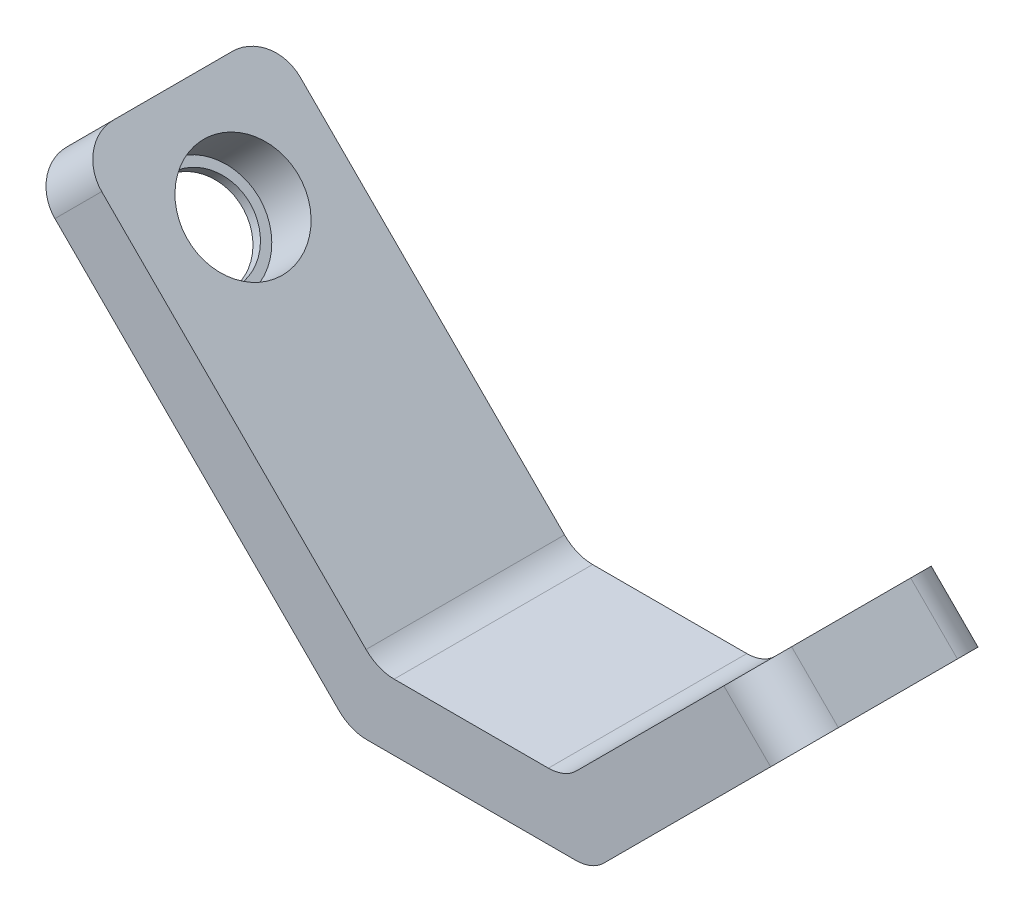
ISO-10303-21;
HEADER;
FILE_DESCRIPTION(('STEP AP214'),'2;1');
FILE_NAME('part.step','',(''),(''),'','','');
FILE_SCHEMA(('AUTOMOTIVE_DESIGN { 1 0 10303 214 1 1 1 1 }'));
ENDSEC;
DATA;
#1=APPLICATION_CONTEXT('core data for automotive mechanical design processes');
#2=APPLICATION_PROTOCOL_DEFINITION('international standard','automotive_design',2000,#1);
#3=PRODUCT_CONTEXT('',#1,'mechanical');
#4=PRODUCT('Part','Part','',(#3));
#5=PRODUCT_RELATED_PRODUCT_CATEGORY('part','',(#4));
#6=PRODUCT_DEFINITION_FORMATION('','',#4);
#7=PRODUCT_DEFINITION_CONTEXT('part definition',#1,'design');
#8=PRODUCT_DEFINITION('design','',#6,#7);
#9=PRODUCT_DEFINITION_SHAPE('','',#8);
#10=(LENGTH_UNIT() NAMED_UNIT(*) SI_UNIT(.MILLI.,.METRE.));
#11=(NAMED_UNIT(*) PLANE_ANGLE_UNIT() SI_UNIT($,.RADIAN.));
#12=(NAMED_UNIT(*) SI_UNIT($,.STERADIAN.) SOLID_ANGLE_UNIT());
#13=UNCERTAINTY_MEASURE_WITH_UNIT(LENGTH_MEASURE(1.E-05),#10,'distance_accuracy_value','');
#14=(GEOMETRIC_REPRESENTATION_CONTEXT(3) GLOBAL_UNCERTAINTY_ASSIGNED_CONTEXT((#13)) GLOBAL_UNIT_ASSIGNED_CONTEXT((#10,
#11,#12)) REPRESENTATION_CONTEXT('',''));
#15=CARTESIAN_POINT('',(0.,0.,0.));
#16=DIRECTION('',(0.,0.,1.));
#17=DIRECTION('',(1.,0.,0.));
#18=AXIS2_PLACEMENT_3D('',#15,#16,#17);
#19=CARTESIAN_POINT('',(18.2842712474618,0.,7.5));
#20=DIRECTION('',(0.,1.,0.));
#21=DIRECTION('',(-1.,0.,0.));
#22=AXIS2_PLACEMENT_3D('',#19,#20,#21);
#23=PLANE('',#22);
#24=DIRECTION('',(1.,0.,0.));
#25=VECTOR('',#24,1.);
#26=CARTESIAN_POINT('',(18.2842712474618,0.,-7.5));
#27=LINE('',#26,#25);
#28=CARTESIAN_POINT('',(1.24264068711928,0.,-7.5));
#29=VERTEX_POINT('',#28);
#30=CARTESIAN_POINT('',(17.0416305603425,0.,-7.5));
#31=VERTEX_POINT('',#30);
#32=EDGE_CURVE('E285',#29,#31,#27,.T.);
#33=ORIENTED_EDGE('',*,*,#32,.T.);
#34=DIRECTION('',(0.,0.,-1.));
#35=VECTOR('',#34,1.);
#36=CARTESIAN_POINT('',(17.0416305603425,0.,7.5));
#37=LINE('',#36,#35);
#38=CARTESIAN_POINT('',(17.0416305603425,0.,7.5));
#39=VERTEX_POINT('',#38);
#40=EDGE_CURVE('E166',#31,#39,#37,.F.);
#41=ORIENTED_EDGE('',*,*,#40,.T.);
#42=DIRECTION('',(1.,0.,0.));
#43=VECTOR('',#42,1.);
#44=CARTESIAN_POINT('',(18.2842712474618,0.,7.5));
#45=LINE('',#44,#43);
#46=CARTESIAN_POINT('',(1.24264068711928,0.,7.5));
#47=VERTEX_POINT('',#46);
#48=EDGE_CURVE('E193',#47,#39,#45,.T.);
#49=ORIENTED_EDGE('',*,*,#48,.F.);
#50=DIRECTION('',(0.,0.,-1.));
#51=VECTOR('',#50,1.);
#52=CARTESIAN_POINT('',(1.24264068711928,0.,7.5));
#53=LINE('',#52,#51);
#54=EDGE_CURVE('E261',#47,#29,#53,.T.);
#55=ORIENTED_EDGE('',*,*,#54,.T.);
#56=EDGE_LOOP('',(#33,#41,#49,#55));
#57=FACE_BOUND('',#56,.T.);
#58=ADVANCED_FACE('F41',(#57),#23,.F.);
#59=CARTESIAN_POINT('',(33.8908729652601,15.6066017177983,7.5));
#60=DIRECTION('',(-0.707106781186549,0.707106781186547,0.));
#61=DIRECTION('',(-0.707106781186547,-0.707106781186549,0.));
#62=AXIS2_PLACEMENT_3D('',#59,#60,#61);
#63=PLANE('',#62);
#64=DIRECTION('',(0.707106781186547,0.707106781186549,0.));
#65=VECTOR('',#64,1.);
#66=CARTESIAN_POINT('',(33.8908729652601,15.6066017177983,-7.5));
#67=LINE('',#66,#65);
#68=CARTESIAN_POINT('',(19.1629509039022,0.878679656440356,-7.5));
#69=VERTEX_POINT('',#68);
#70=CARTESIAN_POINT('',(31.7695526217004,13.4852813742387,-7.5));
#71=VERTEX_POINT('',#70);
#72=EDGE_CURVE('E187',#69,#71,#67,.T.);
#73=ORIENTED_EDGE('',*,*,#72,.T.);
#74=CARTESIAN_POINT('',(31.7695526217004,13.4852813742386,-4.5));
#75=DIRECTION('',(-0.707106781186549,0.707106781186547,0.));
#76=DIRECTION('',(-0.707106781186547,-0.707106781186549,0.));
#77=AXIS2_PLACEMENT_3D('',#74,#75,#76);
#78=CIRCLE('',#77,3.);
#79=CARTESIAN_POINT('',(33.8908729652601,15.6066017177983,-4.5));
#80=VERTEX_POINT('',#79);
#81=EDGE_CURVE('E241',#71,#80,#78,.F.);
#82=ORIENTED_EDGE('',*,*,#81,.T.);
#83=DIRECTION('',(0.,0.,-1.));
#84=VECTOR('',#83,1.);
#85=CARTESIAN_POINT('',(33.8908729652601,15.6066017177983,7.5));
#86=LINE('',#85,#84);
#87=CARTESIAN_POINT('',(33.8908729652601,15.6066017177983,4.5));
#88=VERTEX_POINT('',#87);
#89=EDGE_CURVE('E203',#88,#80,#86,.T.);
#90=ORIENTED_EDGE('',*,*,#89,.F.);
#91=CARTESIAN_POINT('',(31.7695526217004,13.4852813742387,4.5));
#92=DIRECTION('',(-0.707106781186549,0.707106781186547,0.));
#93=DIRECTION('',(-0.707106781186547,-0.707106781186549,0.));
#94=AXIS2_PLACEMENT_3D('',#91,#92,#93);
#95=CIRCLE('',#94,3.);
#96=CARTESIAN_POINT('',(31.7695526217004,13.4852813742387,7.5));
#97=VERTEX_POINT('',#96);
#98=EDGE_CURVE('E239',#88,#97,#95,.F.);
#99=ORIENTED_EDGE('',*,*,#98,.T.);
#100=DIRECTION('',(0.707106781186547,0.707106781186549,0.));
#101=VECTOR('',#100,1.);
#102=CARTESIAN_POINT('',(33.8908729652601,15.6066017177983,7.5));
#103=LINE('',#102,#101);
#104=CARTESIAN_POINT('',(19.1629509039022,0.878679656440356,7.5));
#105=VERTEX_POINT('',#104);
#106=EDGE_CURVE('E274',#105,#97,#103,.T.);
#107=ORIENTED_EDGE('',*,*,#106,.F.);
#108=DIRECTION('',(0.,0.,-1.));
#109=VECTOR('',#108,1.);
#110=CARTESIAN_POINT('',(19.1629509039022,0.878679656440356,7.5));
#111=LINE('',#110,#109);
#112=EDGE_CURVE('E236',#105,#69,#111,.T.);
#113=ORIENTED_EDGE('',*,*,#112,.T.);
#114=EDGE_LOOP('',(#73,#82,#90,#99,#107,#113));
#115=FACE_BOUND('',#114,.T.);
#116=CARTESIAN_POINT('',(28.587572106361,10.3033008588992,0.));
#117=DIRECTION('',(-0.707106781186548,0.707106781186547,0.));
#118=DIRECTION('',(-0.707106781186547,-0.707106781186548,0.));
#119=AXIS2_PLACEMENT_3D('',#116,#117,#118);
#120=CIRCLE('',#119,3.5);
#121=CARTESIAN_POINT('',(26.1126983722081,7.82842712474625,0.));
#122=VERTEX_POINT('',#121);
#123=EDGE_CURVE('E616',#122,#122,#120,.T.);
#124=ORIENTED_EDGE('',*,*,#123,.T.);
#125=EDGE_LOOP('',(#124));
#126=FACE_BOUND('',#125,.T.);
#127=ADVANCED_FACE('F291',(#115,#126),#63,.F.);
#128=CARTESIAN_POINT('',(30.3553390593273,19.142135623731,7.5));
#129=DIRECTION('',(-0.707106781186546,-0.707106781186549,0.));
#130=DIRECTION('',(0.707106781186549,-0.707106781186546,0.));
#131=AXIS2_PLACEMENT_3D('',#128,#129,#130);
#132=PLANE('',#131);
#133=ORIENTED_EDGE('',*,*,#89,.T.);
#134=DIRECTION('',(-0.707106781186549,0.707106781186546,0.));
#135=VECTOR('',#134,1.);
#136=CARTESIAN_POINT('',(30.3553390593273,19.142135623731,-4.5));
#137=LINE('',#136,#135);
#138=CARTESIAN_POINT('',(30.3553390593273,19.142135623731,-4.5));
#139=VERTEX_POINT('',#138);
#140=EDGE_CURVE('E225',#80,#139,#137,.T.);
#141=ORIENTED_EDGE('',*,*,#140,.T.);
#142=DIRECTION('',(0.,0.,-1.));
#143=VECTOR('',#142,1.);
#144=CARTESIAN_POINT('',(30.3553390593273,19.142135623731,7.5));
#145=LINE('',#144,#143);
#146=CARTESIAN_POINT('',(30.3553390593273,19.142135623731,4.5));
#147=VERTEX_POINT('',#146);
#148=EDGE_CURVE('E200',#147,#139,#145,.T.);
#149=ORIENTED_EDGE('',*,*,#148,.F.);
#150=DIRECTION('',(-0.707106781186549,0.707106781186546,0.));
#151=VECTOR('',#150,1.);
#152=CARTESIAN_POINT('',(30.3553390593273,19.142135623731,4.5));
#153=LINE('',#152,#151);
#154=EDGE_CURVE('E223',#147,#88,#153,.F.);
#155=ORIENTED_EDGE('',*,*,#154,.T.);
#156=EDGE_LOOP('',(#133,#141,#149,#155));
#157=FACE_BOUND('',#156,.T.);
#158=ADVANCED_FACE('F302',(#157),#132,.F.);
#159=CARTESIAN_POINT('',(16.2132034355964,5.00000000000005,7.5));
#160=DIRECTION('',(0.707106781186549,-0.707106781186546,0.));
#161=DIRECTION('',(0.707106781186546,0.707106781186549,0.));
#162=AXIS2_PLACEMENT_3D('',#159,#160,#161);
#163=PLANE('',#162);
#164=CARTESIAN_POINT('',(25.0520382004282,13.8388347648319,0.));
#165=DIRECTION('',(0.707106781186549,-0.707106781186546,0.));
#166=DIRECTION('',(0.707106781186546,0.707106781186549,0.));
#167=AXIS2_PLACEMENT_3D('',#164,#165,#166);
#168=CIRCLE('',#167,4.2);
#169=CARTESIAN_POINT('',(28.0218866814117,16.8086832458154,0.));
#170=VERTEX_POINT('',#169);
#171=EDGE_CURVE('E206',#170,#170,#168,.T.);
#172=ORIENTED_EDGE('',*,*,#171,.T.);
#173=EDGE_LOOP('',(#172));
#174=FACE_BOUND('',#173,.T.);
#175=DIRECTION('',(-0.707106781186546,-0.707106781186549,0.));
#176=VECTOR('',#175,1.);
#177=CARTESIAN_POINT('',(16.2132034355964,5.00000000000005,-7.5));
#178=LINE('',#177,#176);
#179=CARTESIAN_POINT('',(28.2340187157677,17.0208152801714,-7.5));
#180=VERTEX_POINT('',#179);
#181=CARTESIAN_POINT('',(17.0918830920367,5.87867965644041,-7.5));
#182=VERTEX_POINT('',#181);
#183=EDGE_CURVE('E182',#180,#182,#178,.T.);
#184=ORIENTED_EDGE('',*,*,#183,.T.);
#185=DIRECTION('',(0.,0.,-1.));
#186=VECTOR('',#185,1.);
#187=CARTESIAN_POINT('',(17.0918830920367,5.87867965644041,7.5));
#188=LINE('',#187,#186);
#189=CARTESIAN_POINT('',(17.0918830920367,5.87867965644041,7.5));
#190=VERTEX_POINT('',#189);
#191=EDGE_CURVE('E160',#182,#190,#188,.F.);
#192=ORIENTED_EDGE('',*,*,#191,.T.);
#193=DIRECTION('',(-0.707106781186546,-0.707106781186549,0.));
#194=VECTOR('',#193,1.);
#195=CARTESIAN_POINT('',(16.2132034355964,5.00000000000005,7.5));
#196=LINE('',#195,#194);
#197=CARTESIAN_POINT('',(28.2340187157677,17.0208152801714,7.5));
#198=VERTEX_POINT('',#197);
#199=EDGE_CURVE('E271',#198,#190,#196,.T.);
#200=ORIENTED_EDGE('',*,*,#199,.F.);
#201=CARTESIAN_POINT('',(28.2340187157677,17.0208152801714,4.5));
#202=DIRECTION('',(0.707106781186549,-0.707106781186546,0.));
#203=DIRECTION('',(0.707106781186546,0.707106781186549,0.));
#204=AXIS2_PLACEMENT_3D('',#201,#202,#203);
#205=CIRCLE('',#204,3.);
#206=EDGE_CURVE('E176',#198,#147,#205,.F.);
#207=ORIENTED_EDGE('',*,*,#206,.T.);
#208=ORIENTED_EDGE('',*,*,#148,.T.);
#209=CARTESIAN_POINT('',(28.2340187157677,17.0208152801714,-4.5));
#210=DIRECTION('',(0.707106781186549,-0.707106781186546,0.));
#211=DIRECTION('',(0.707106781186546,0.707106781186549,0.));
#212=AXIS2_PLACEMENT_3D('',#209,#210,#211);
#213=CIRCLE('',#212,3.);
#214=EDGE_CURVE('E213',#139,#180,#213,.F.);
#215=ORIENTED_EDGE('',*,*,#214,.T.);
#216=EDGE_LOOP('',(#184,#192,#200,#207,#208,#215));
#217=FACE_BOUND('',#216,.T.);
#218=ADVANCED_FACE('F304',(#174,#217),#163,.F.);
#219=CARTESIAN_POINT('',(2.07106781186543,5.00000000000005,7.5));
#220=DIRECTION('',(0.,-1.,0.));
#221=DIRECTION('',(1.,0.,0.));
#222=AXIS2_PLACEMENT_3D('',#219,#220,#221);
#223=PLANE('',#222);
#224=DIRECTION('',(-1.,0.,0.));
#225=VECTOR('',#224,1.);
#226=CARTESIAN_POINT('',(2.07106781186543,5.00000000000005,7.5));
#227=LINE('',#226,#225);
#228=CARTESIAN_POINT('',(14.9705627484771,5.00000000000005,7.5));
#229=VERTEX_POINT('',#228);
#230=CARTESIAN_POINT('',(3.31370849898471,5.00000000000005,7.5));
#231=VERTEX_POINT('',#230);
#232=EDGE_CURVE('E175',#229,#231,#227,.T.);
#233=ORIENTED_EDGE('',*,*,#232,.F.);
#234=DIRECTION('',(0.,0.,-1.));
#235=VECTOR('',#234,1.);
#236=CARTESIAN_POINT('',(14.9705627484771,5.00000000000005,-7.5));
#237=LINE('',#236,#235);
#238=CARTESIAN_POINT('',(14.9705627484771,5.00000000000005,-7.5));
#239=VERTEX_POINT('',#238);
#240=EDGE_CURVE('E159',#229,#239,#237,.T.);
#241=ORIENTED_EDGE('',*,*,#240,.T.);
#242=DIRECTION('',(-1.,0.,0.));
#243=VECTOR('',#242,1.);
#244=CARTESIAN_POINT('',(2.07106781186543,5.00000000000005,-7.5));
#245=LINE('',#244,#243);
#246=CARTESIAN_POINT('',(3.31370849898471,5.00000000000005,-7.5));
#247=VERTEX_POINT('',#246);
#248=EDGE_CURVE('E172',#239,#247,#245,.T.);
#249=ORIENTED_EDGE('',*,*,#248,.T.);
#250=DIRECTION('',(0.,0.,-1.));
#251=VECTOR('',#250,1.);
#252=CARTESIAN_POINT('',(3.31370849898471,5.00000000000005,7.5));
#253=LINE('',#252,#251);
#254=EDGE_CURVE('E177',#247,#231,#253,.F.);
#255=ORIENTED_EDGE('',*,*,#254,.T.);
#256=EDGE_LOOP('',(#233,#241,#249,#255));
#257=FACE_BOUND('',#256,.T.);
#258=ADVANCED_FACE('F171',(#257),#223,.F.);
#259=CARTESIAN_POINT('',(-20.9099025766974,27.9809703885628,7.5));
#260=DIRECTION('',(-0.707106781186547,-0.707106781186547,0.));
#261=DIRECTION('',(0.707106781186548,-0.707106781186548,0.));
#262=AXIS2_PLACEMENT_3D('',#259,#260,#261);
#263=PLANE('',#262);
#264=CARTESIAN_POINT('',(-15.6066017177982,22.6776695296637,0.));
#265=DIRECTION('',(-0.707106781186547,-0.707106781186547,0.));
#266=DIRECTION('',(0.707106781186548,-0.707106781186548,0.));
#267=AXIS2_PLACEMENT_3D('',#264,#265,#266);
#268=CIRCLE('',#267,4.2);
#269=CARTESIAN_POINT('',(-12.6367532368147,19.7078210486802,0.));
#270=VERTEX_POINT('',#269);
#271=EDGE_CURVE('E209',#270,#270,#268,.T.);
#272=ORIENTED_EDGE('',*,*,#271,.T.);
#273=EDGE_LOOP('',(#272));
#274=FACE_BOUND('',#273,.T.);
#275=DIRECTION('',(-0.707106781186548,0.707106781186548,0.));
#276=VECTOR('',#275,1.);
#277=CARTESIAN_POINT('',(-20.9099025766974,27.9809703885628,7.5));
#278=LINE('',#277,#276);
#279=CARTESIAN_POINT('',(1.19238815542507,5.8786796564404,7.5));
#280=VERTEX_POINT('',#279);
#281=CARTESIAN_POINT('',(-18.7885822331377,25.8596500450032,7.5));
#282=VERTEX_POINT('',#281);
#283=EDGE_CURVE('E276',#280,#282,#278,.T.);
#284=ORIENTED_EDGE('',*,*,#283,.F.);
#285=DIRECTION('',(0.,0.,-1.));
#286=VECTOR('',#285,1.);
#287=CARTESIAN_POINT('',(1.19238815542507,5.87867965644041,-7.5));
#288=LINE('',#287,#286);
#289=CARTESIAN_POINT('',(1.19238815542507,5.8786796564404,-7.5));
#290=VERTEX_POINT('',#289);
#291=EDGE_CURVE('E220',#280,#290,#288,.T.);
#292=ORIENTED_EDGE('',*,*,#291,.T.);
#293=DIRECTION('',(-0.707106781186548,0.707106781186548,0.));
#294=VECTOR('',#293,1.);
#295=CARTESIAN_POINT('',(-20.9099025766974,27.9809703885628,-7.5));
#296=LINE('',#295,#294);
#297=CARTESIAN_POINT('',(-18.7885822331377,25.8596500450032,-7.5));
#298=VERTEX_POINT('',#297);
#299=EDGE_CURVE('E181',#290,#298,#296,.T.);
#300=ORIENTED_EDGE('',*,*,#299,.T.);
#301=CARTESIAN_POINT('',(-18.7885822331377,25.8596500450032,-4.5));
#302=DIRECTION('',(-0.707106781186547,-0.707106781186547,0.));
#303=DIRECTION('',(0.707106781186548,-0.707106781186548,0.));
#304=AXIS2_PLACEMENT_3D('',#301,#302,#303);
#305=CIRCLE('',#304,3.);
#306=CARTESIAN_POINT('',(-20.9099025766974,27.9809703885628,-4.5));
#307=VERTEX_POINT('',#306);
#308=EDGE_CURVE('E218',#298,#307,#305,.F.);
#309=ORIENTED_EDGE('',*,*,#308,.T.);
#310=DIRECTION('',(0.,0.,-1.));
#311=VECTOR('',#310,1.);
#312=CARTESIAN_POINT('',(-20.9099025766974,27.9809703885628,7.5));
#313=LINE('',#312,#311);
#314=CARTESIAN_POINT('',(-20.9099025766974,27.9809703885628,4.5));
#315=VERTEX_POINT('',#314);
#316=EDGE_CURVE('E196',#315,#307,#313,.T.);
#317=ORIENTED_EDGE('',*,*,#316,.F.);
#318=CARTESIAN_POINT('',(-18.7885822331377,25.8596500450032,4.5));
#319=DIRECTION('',(-0.707106781186547,-0.707106781186547,0.));
#320=DIRECTION('',(0.707106781186548,-0.707106781186548,0.));
#321=AXIS2_PLACEMENT_3D('',#318,#319,#320);
#322=CIRCLE('',#321,3.);
#323=EDGE_CURVE('E216',#315,#282,#322,.F.);
#324=ORIENTED_EDGE('',*,*,#323,.T.);
#325=EDGE_LOOP('',(#284,#292,#300,#309,#317,#324));
#326=FACE_BOUND('',#325,.T.);
#327=ADVANCED_FACE('F333',(#274,#326),#263,.F.);
#328=CARTESIAN_POINT('',(-24.4454364826301,24.4454364826301,7.5));
#329=DIRECTION('',(0.707106781186547,-0.707106781186548,0.));
#330=DIRECTION('',(0.707106781186548,0.707106781186547,0.));
#331=AXIS2_PLACEMENT_3D('',#328,#329,#330);
#332=PLANE('',#331);
#333=ORIENTED_EDGE('',*,*,#316,.T.);
#334=DIRECTION('',(-0.707106781186548,-0.707106781186547,0.));
#335=VECTOR('',#334,1.);
#336=CARTESIAN_POINT('',(-24.4454364826301,24.4454364826301,-4.5));
#337=LINE('',#336,#335);
#338=CARTESIAN_POINT('',(-24.4454364826301,24.4454364826301,-4.5));
#339=VERTEX_POINT('',#338);
#340=EDGE_CURVE('E255',#307,#339,#337,.T.);
#341=ORIENTED_EDGE('',*,*,#340,.T.);
#342=DIRECTION('',(0.,0.,-1.));
#343=VECTOR('',#342,1.);
#344=CARTESIAN_POINT('',(-24.4454364826301,24.4454364826301,7.5));
#345=LINE('',#344,#343);
#346=CARTESIAN_POINT('',(-24.4454364826301,24.4454364826301,4.5));
#347=VERTEX_POINT('',#346);
#348=EDGE_CURVE('E194',#347,#339,#345,.T.);
#349=ORIENTED_EDGE('',*,*,#348,.F.);
#350=DIRECTION('',(-0.707106781186548,-0.707106781186547,0.));
#351=VECTOR('',#350,1.);
#352=CARTESIAN_POINT('',(-24.4454364826301,24.4454364826301,4.5));
#353=LINE('',#352,#351);
#354=EDGE_CURVE('E253',#347,#315,#353,.F.);
#355=ORIENTED_EDGE('',*,*,#354,.T.);
#356=EDGE_LOOP('',(#333,#341,#349,#355));
#357=FACE_BOUND('',#356,.T.);
#358=ADVANCED_FACE('F325',(#357),#332,.F.);
#359=CARTESIAN_POINT('',(0.,0.,7.5));
#360=DIRECTION('',(0.707106781186547,0.707106781186548,0.));
#361=DIRECTION('',(-0.707106781186548,0.707106781186547,0.));
#362=AXIS2_PLACEMENT_3D('',#359,#360,#361);
#363=PLANE('',#362);
#364=ORIENTED_EDGE('',*,*,#348,.T.);
#365=CARTESIAN_POINT('',(-22.3241161390705,22.3241161390705,-4.5));
#366=DIRECTION('',(0.707106781186547,0.707106781186548,0.));
#367=DIRECTION('',(-0.707106781186548,0.707106781186547,0.));
#368=AXIS2_PLACEMENT_3D('',#365,#366,#367);
#369=CIRCLE('',#368,3.);
#370=CARTESIAN_POINT('',(-22.3241161390705,22.3241161390704,-7.5));
#371=VERTEX_POINT('',#370);
#372=EDGE_CURVE('E56',#339,#371,#369,.F.);
#373=ORIENTED_EDGE('',*,*,#372,.T.);
#374=DIRECTION('',(0.707106781186548,-0.707106781186547,0.));
#375=VECTOR('',#374,1.);
#376=CARTESIAN_POINT('',(0.,0.,-7.5));
#377=LINE('',#376,#375);
#378=CARTESIAN_POINT('',(-0.878679656440358,0.878679656440357,-7.5));
#379=VERTEX_POINT('',#378);
#380=EDGE_CURVE('E185',#371,#379,#377,.T.);
#381=ORIENTED_EDGE('',*,*,#380,.T.);
#382=DIRECTION('',(0.,0.,-1.));
#383=VECTOR('',#382,1.);
#384=CARTESIAN_POINT('',(-0.878679656440358,0.878679656440357,7.5));
#385=LINE('',#384,#383);
#386=CARTESIAN_POINT('',(-0.878679656440358,0.878679656440357,7.5));
#387=VERTEX_POINT('',#386);
#388=EDGE_CURVE('E257',#379,#387,#385,.F.);
#389=ORIENTED_EDGE('',*,*,#388,.T.);
#390=DIRECTION('',(0.707106781186548,-0.707106781186547,0.));
#391=VECTOR('',#390,1.);
#392=CARTESIAN_POINT('',(0.,0.,7.5));
#393=LINE('',#392,#391);
#394=CARTESIAN_POINT('',(-22.3241161390705,22.3241161390704,7.5));
#395=VERTEX_POINT('',#394);
#396=EDGE_CURVE('E197',#395,#387,#393,.T.);
#397=ORIENTED_EDGE('',*,*,#396,.F.);
#398=CARTESIAN_POINT('',(-22.3241161390705,22.3241161390705,4.5));
#399=DIRECTION('',(0.707106781186547,0.707106781186548,0.));
#400=DIRECTION('',(-0.707106781186548,0.707106781186547,0.));
#401=AXIS2_PLACEMENT_3D('',#398,#399,#400);
#402=CIRCLE('',#401,3.);
#403=EDGE_CURVE('E64',#395,#347,#402,.F.);
#404=ORIENTED_EDGE('',*,*,#403,.T.);
#405=EDGE_LOOP('',(#364,#373,#381,#389,#397,#404));
#406=FACE_BOUND('',#405,.T.);
#407=CARTESIAN_POINT('',(-19.142135623731,19.142135623731,0.));
#408=DIRECTION('',(0.707106781186547,0.707106781186548,0.));
#409=DIRECTION('',(-0.707106781186548,0.707106781186547,0.));
#410=AXIS2_PLACEMENT_3D('',#407,#408,#409);
#411=CIRCLE('',#410,3.5);
#412=CARTESIAN_POINT('',(-21.6170093578839,21.6170093578839,0.));
#413=VERTEX_POINT('',#412);
#414=EDGE_CURVE('E607',#413,#413,#411,.T.);
#415=ORIENTED_EDGE('',*,*,#414,.T.);
#416=EDGE_LOOP('',(#415));
#417=FACE_BOUND('',#416,.T.);
#418=ADVANCED_FACE('F321',(#406,#417),#363,.F.);
#419=CARTESIAN_POINT('',(0.,0.,7.5));
#420=DIRECTION('',(0.,0.,-1.));
#421=DIRECTION('',(-1.,0.,0.));
#422=AXIS2_PLACEMENT_3D('',#419,#420,#421);
#423=PLANE('',#422);
#424=ORIENTED_EDGE('',*,*,#106,.T.);
#425=DIRECTION('',(-0.707106781186549,0.707106781186546,0.));
#426=VECTOR('',#425,1.);
#427=CARTESIAN_POINT('',(22.6274169979695,22.6274169979696,7.5));
#428=LINE('',#427,#426);
#429=EDGE_CURVE('E250',#97,#198,#428,.T.);
#430=ORIENTED_EDGE('',*,*,#429,.T.);
#431=ORIENTED_EDGE('',*,*,#199,.T.);
#432=CARTESIAN_POINT('',(14.9705627484771,8.00000000000005,7.5));
#433=DIRECTION('',(0.,0.,-1.));
#434=DIRECTION('',(-1.,0.,0.));
#435=AXIS2_PLACEMENT_3D('',#432,#433,#434);
#436=CIRCLE('',#435,3.);
#437=EDGE_CURVE('E165',#190,#229,#436,.T.);
#438=ORIENTED_EDGE('',*,*,#437,.T.);
#439=ORIENTED_EDGE('',*,*,#232,.T.);
#440=CARTESIAN_POINT('',(3.31370849898471,8.00000000000005,7.5));
#441=DIRECTION('',(0.,0.,-1.));
#442=DIRECTION('',(-1.,0.,0.));
#443=AXIS2_PLACEMENT_3D('',#440,#441,#442);
#444=CIRCLE('',#443,3.);
#445=EDGE_CURVE('E11',#231,#280,#444,.T.);
#446=ORIENTED_EDGE('',*,*,#445,.T.);
#447=ORIENTED_EDGE('',*,*,#283,.T.);
#448=DIRECTION('',(-0.707106781186548,-0.707106781186547,0.));
#449=VECTOR('',#448,1.);
#450=CARTESIAN_POINT('',(-22.3241161390704,22.3241161390705,7.5));
#451=LINE('',#450,#449);
#452=EDGE_CURVE('E247',#282,#395,#451,.T.);
#453=ORIENTED_EDGE('',*,*,#452,.T.);
#454=ORIENTED_EDGE('',*,*,#396,.T.);
#455=CARTESIAN_POINT('',(1.24264068711928,3.,7.5));
#456=DIRECTION('',(0.,0.,-1.));
#457=DIRECTION('',(-1.,0.,0.));
#458=AXIS2_PLACEMENT_3D('',#455,#456,#457);
#459=CIRCLE('',#458,3.);
#460=EDGE_CURVE('E243',#387,#47,#459,.F.);
#461=ORIENTED_EDGE('',*,*,#460,.T.);
#462=ORIENTED_EDGE('',*,*,#48,.T.);
#463=CARTESIAN_POINT('',(17.0416305603425,3.,7.5));
#464=DIRECTION('',(0.,0.,-1.));
#465=DIRECTION('',(-1.,0.,0.));
#466=AXIS2_PLACEMENT_3D('',#463,#464,#465);
#467=CIRCLE('',#466,3.);
#468=EDGE_CURVE('E245',#39,#105,#467,.F.);
#469=ORIENTED_EDGE('',*,*,#468,.T.);
#470=EDGE_LOOP('',(#424,#430,#431,#438,#439,#446,#447,#453,#454,#461,#462,#469));
#471=FACE_BOUND('',#470,.T.);
#472=ADVANCED_FACE('F268',(#471),#423,.F.);
#473=CARTESIAN_POINT('',(0.,0.,-7.5));
#474=DIRECTION('',(0.,0.,-1.));
#475=DIRECTION('',(-1.,0.,0.));
#476=AXIS2_PLACEMENT_3D('',#473,#474,#475);
#477=PLANE('',#476);
#478=ORIENTED_EDGE('',*,*,#183,.F.);
#479=DIRECTION('',(-0.707106781186549,0.707106781186546,0.));
#480=VECTOR('',#479,1.);
#481=CARTESIAN_POINT('',(31.7695526217004,13.4852813742386,-7.5));
#482=LINE('',#481,#480);
#483=EDGE_CURVE('E234',#180,#71,#482,.F.);
#484=ORIENTED_EDGE('',*,*,#483,.T.);
#485=ORIENTED_EDGE('',*,*,#72,.F.);
#486=CARTESIAN_POINT('',(17.0416305603425,3.,-7.5));
#487=DIRECTION('',(0.,0.,-1.));
#488=DIRECTION('',(-1.,0.,0.));
#489=AXIS2_PLACEMENT_3D('',#486,#487,#488);
#490=CIRCLE('',#489,3.);
#491=EDGE_CURVE('E230',#69,#31,#490,.T.);
#492=ORIENTED_EDGE('',*,*,#491,.T.);
#493=ORIENTED_EDGE('',*,*,#32,.F.);
#494=CARTESIAN_POINT('',(1.24264068711928,3.,-7.5));
#495=DIRECTION('',(0.,0.,-1.));
#496=DIRECTION('',(-1.,0.,0.));
#497=AXIS2_PLACEMENT_3D('',#494,#495,#496);
#498=CIRCLE('',#497,3.);
#499=EDGE_CURVE('E228',#29,#379,#498,.T.);
#500=ORIENTED_EDGE('',*,*,#499,.T.);
#501=ORIENTED_EDGE('',*,*,#380,.F.);
#502=DIRECTION('',(-0.707106781186548,-0.707106781186547,0.));
#503=VECTOR('',#502,1.);
#504=CARTESIAN_POINT('',(-18.7885822331377,25.8596500450032,-7.5));
#505=LINE('',#504,#503);
#506=EDGE_CURVE('E232',#371,#298,#505,.F.);
#507=ORIENTED_EDGE('',*,*,#506,.T.);
#508=ORIENTED_EDGE('',*,*,#299,.F.);
#509=CARTESIAN_POINT('',(3.31370849898471,8.00000000000005,-7.5));
#510=DIRECTION('',(0.,0.,-1.));
#511=DIRECTION('',(-1.,0.,0.));
#512=AXIS2_PLACEMENT_3D('',#509,#510,#511);
#513=CIRCLE('',#512,3.);
#514=EDGE_CURVE('E49',#290,#247,#513,.F.);
#515=ORIENTED_EDGE('',*,*,#514,.T.);
#516=ORIENTED_EDGE('',*,*,#248,.F.);
#517=CARTESIAN_POINT('',(14.9705627484771,8.00000000000005,-7.5));
#518=DIRECTION('',(0.,0.,-1.));
#519=DIRECTION('',(-1.,0.,0.));
#520=AXIS2_PLACEMENT_3D('',#517,#518,#519);
#521=CIRCLE('',#520,3.);
#522=EDGE_CURVE('E155',#239,#182,#521,.F.);
#523=ORIENTED_EDGE('',*,*,#522,.T.);
#524=EDGE_LOOP('',(#478,#484,#485,#492,#493,#500,#501,#507,#508,#515,#516,#523));
#525=FACE_BOUND('',#524,.T.);
#526=ADVANCED_FACE('F179',(#525),#477,.T.);
#527=CARTESIAN_POINT('',(11.7937860531805,50.0780573006424,0.));
#528=DIRECTION('',(-0.707106781186549,-0.707106781186546,0.));
#529=DIRECTION('',(0.707106781186546,-0.707106781186549,0.));
#530=AXIS2_PLACEMENT_3D('',#527,#528,#529);
#531=CYLINDRICAL_SURFACE('',#530,4.2);
#532=CARTESIAN_POINT('',(-18.5764501987817,19.7078210486802,0.));
#533=DIRECTION('',(0.707106781186547,0.707106781186548,0.));
#534=DIRECTION('',(-0.707106781186548,0.707106781186547,0.));
#535=AXIS2_PLACEMENT_3D('',#532,#533,#534);
#536=CIRCLE('',#535,4.2);
#537=CARTESIAN_POINT('',(-21.5462986797652,22.6776695296637,0.));
#538=VERTEX_POINT('',#537);
#539=EDGE_CURVE('E210',#538,#538,#536,.T.);
#540=ORIENTED_EDGE('',*,*,#539,.F.);
#541=EDGE_LOOP('',(#540));
#542=FACE_BOUND('',#541,.T.);
#543=ORIENTED_EDGE('',*,*,#271,.F.);
#544=EDGE_LOOP('',(#543));
#545=FACE_BOUND('',#544,.T.);
#546=ADVANCED_FACE('F417',(#542,#545),#531,.F.);
#547=CARTESIAN_POINT('',(-6.76776695296651,45.6586399182265,0.));
#548=DIRECTION('',(0.707106781186549,-0.707106781186546,0.));
#549=DIRECTION('',(0.707106781186546,0.707106781186549,0.));
#550=AXIS2_PLACEMENT_3D('',#547,#548,#549);
#551=CYLINDRICAL_SURFACE('',#550,4.2);
#552=CARTESIAN_POINT('',(28.0218866814117,10.8689862838484,0.));
#553=DIRECTION('',(-0.707106781186548,0.707106781186547,0.));
#554=DIRECTION('',(-0.707106781186547,-0.707106781186548,0.));
#555=AXIS2_PLACEMENT_3D('',#552,#553,#554);
#556=CIRCLE('',#555,4.2);
#557=CARTESIAN_POINT('',(25.0520382004282,7.8991378028649,0.));
#558=VERTEX_POINT('',#557);
#559=EDGE_CURVE('E610',#558,#558,#556,.T.);
#560=ORIENTED_EDGE('',*,*,#559,.F.);
#561=EDGE_LOOP('',(#560));
#562=FACE_BOUND('',#561,.T.);
#563=ORIENTED_EDGE('',*,*,#171,.F.);
#564=EDGE_LOOP('',(#563));
#565=FACE_BOUND('',#564,.T.);
#566=ADVANCED_FACE('F357',(#562,#565),#551,.F.);
#567=CARTESIAN_POINT('',(14.9705627484771,8.00000000000005,7.5));
#568=DIRECTION('',(0.,0.,1.));
#569=DIRECTION('',(1.,0.,0.));
#570=AXIS2_PLACEMENT_3D('',#567,#568,#569);
#571=CYLINDRICAL_SURFACE('',#570,3.);
#572=ORIENTED_EDGE('',*,*,#437,.F.);
#573=ORIENTED_EDGE('',*,*,#191,.F.);
#574=ORIENTED_EDGE('',*,*,#522,.F.);
#575=ORIENTED_EDGE('',*,*,#240,.F.);
#576=EDGE_LOOP('',(#572,#573,#574,#575));
#577=FACE_BOUND('',#576,.T.);
#578=ADVANCED_FACE('F158',(#577),#571,.F.);
#579=CARTESIAN_POINT('',(3.31370849898471,8.00000000000005,7.5));
#580=DIRECTION('',(0.,0.,1.));
#581=DIRECTION('',(1.,0.,0.));
#582=AXIS2_PLACEMENT_3D('',#579,#580,#581);
#583=CYLINDRICAL_SURFACE('',#582,3.);
#584=ORIENTED_EDGE('',*,*,#445,.F.);
#585=ORIENTED_EDGE('',*,*,#254,.F.);
#586=ORIENTED_EDGE('',*,*,#514,.F.);
#587=ORIENTED_EDGE('',*,*,#291,.F.);
#588=EDGE_LOOP('',(#584,#585,#586,#587));
#589=FACE_BOUND('',#588,.T.);
#590=ADVANCED_FACE('F336',(#589),#583,.F.);
#591=CARTESIAN_POINT('',(28.2340187157677,17.0208152801714,-4.5));
#592=DIRECTION('',(0.707106781186549,-0.707106781186546,0.));
#593=DIRECTION('',(0.707106781186546,0.707106781186549,0.));
#594=AXIS2_PLACEMENT_3D('',#591,#592,#593);
#595=CYLINDRICAL_SURFACE('',#594,3.);
#596=ORIENTED_EDGE('',*,*,#81,.F.);
#597=ORIENTED_EDGE('',*,*,#483,.F.);
#598=ORIENTED_EDGE('',*,*,#214,.F.);
#599=ORIENTED_EDGE('',*,*,#140,.F.);
#600=EDGE_LOOP('',(#596,#597,#598,#599));
#601=FACE_BOUND('',#600,.T.);
#602=ADVANCED_FACE('F299',(#601),#595,.T.);
#603=CARTESIAN_POINT('',(22.6274169979695,22.6274169979696,4.5));
#604=DIRECTION('',(-0.707106781186549,0.707106781186546,0.));
#605=DIRECTION('',(-0.707106781186546,-0.707106781186549,0.));
#606=AXIS2_PLACEMENT_3D('',#603,#604,#605);
#607=CYLINDRICAL_SURFACE('',#606,3.);
#608=ORIENTED_EDGE('',*,*,#98,.F.);
#609=ORIENTED_EDGE('',*,*,#154,.F.);
#610=ORIENTED_EDGE('',*,*,#206,.F.);
#611=ORIENTED_EDGE('',*,*,#429,.F.);
#612=EDGE_LOOP('',(#608,#609,#610,#611));
#613=FACE_BOUND('',#612,.T.);
#614=ADVANCED_FACE('F307',(#613),#607,.T.);
#615=CARTESIAN_POINT('',(-22.3241161390705,22.3241161390705,-4.5));
#616=DIRECTION('',(0.707106781186548,0.707106781186547,0.));
#617=DIRECTION('',(-0.707106781186547,0.707106781186548,0.));
#618=AXIS2_PLACEMENT_3D('',#615,#616,#617);
#619=CYLINDRICAL_SURFACE('',#618,3.);
#620=ORIENTED_EDGE('',*,*,#308,.F.);
#621=ORIENTED_EDGE('',*,*,#506,.F.);
#622=ORIENTED_EDGE('',*,*,#372,.F.);
#623=ORIENTED_EDGE('',*,*,#340,.F.);
#624=EDGE_LOOP('',(#620,#621,#622,#623));
#625=FACE_BOUND('',#624,.T.);
#626=ADVANCED_FACE('F338',(#625),#619,.T.);
#627=CARTESIAN_POINT('',(-22.3241161390704,22.3241161390705,4.5));
#628=DIRECTION('',(-0.707106781186548,-0.707106781186547,0.));
#629=DIRECTION('',(0.707106781186547,-0.707106781186548,0.));
#630=AXIS2_PLACEMENT_3D('',#627,#628,#629);
#631=CYLINDRICAL_SURFACE('',#630,3.);
#632=ORIENTED_EDGE('',*,*,#323,.F.);
#633=ORIENTED_EDGE('',*,*,#354,.F.);
#634=ORIENTED_EDGE('',*,*,#403,.F.);
#635=ORIENTED_EDGE('',*,*,#452,.F.);
#636=EDGE_LOOP('',(#632,#633,#634,#635));
#637=FACE_BOUND('',#636,.T.);
#638=ADVANCED_FACE('F329',(#637),#631,.T.);
#639=CARTESIAN_POINT('',(17.0416305603425,3.,7.5));
#640=DIRECTION('',(0.,0.,-1.));
#641=DIRECTION('',(-1.,0.,0.));
#642=AXIS2_PLACEMENT_3D('',#639,#640,#641);
#643=CYLINDRICAL_SURFACE('',#642,3.);
#644=ORIENTED_EDGE('',*,*,#468,.F.);
#645=ORIENTED_EDGE('',*,*,#40,.F.);
#646=ORIENTED_EDGE('',*,*,#491,.F.);
#647=ORIENTED_EDGE('',*,*,#112,.F.);
#648=EDGE_LOOP('',(#644,#645,#646,#647));
#649=FACE_BOUND('',#648,.T.);
#650=ADVANCED_FACE('F313',(#649),#643,.T.);
#651=CARTESIAN_POINT('',(1.24264068711928,3.,7.5));
#652=DIRECTION('',(0.,0.,-1.));
#653=DIRECTION('',(-1.,0.,0.));
#654=AXIS2_PLACEMENT_3D('',#651,#652,#653);
#655=CYLINDRICAL_SURFACE('',#654,3.);
#656=ORIENTED_EDGE('',*,*,#460,.F.);
#657=ORIENTED_EDGE('',*,*,#388,.F.);
#658=ORIENTED_EDGE('',*,*,#499,.F.);
#659=ORIENTED_EDGE('',*,*,#54,.F.);
#660=EDGE_LOOP('',(#656,#657,#658,#659));
#661=FACE_BOUND('',#660,.T.);
#662=ADVANCED_FACE('F43',(#661),#655,.T.);
#663=CARTESIAN_POINT('',(-18.5764501987817,19.7078210486802,0.));
#664=DIRECTION('',(0.707106781186547,0.707106781186548,0.));
#665=DIRECTION('',(-0.707106781186548,0.707106781186547,0.));
#666=AXIS2_PLACEMENT_3D('',#663,#664,#665);
#667=PLANE('',#666);
#668=ORIENTED_EDGE('',*,*,#539,.T.);
#669=EDGE_LOOP('',(#668));
#670=FACE_BOUND('',#669,.T.);
#671=CARTESIAN_POINT('',(-18.5764501987817,19.7078210486802,0.));
#672=DIRECTION('',(0.707106781186547,0.707106781186548,0.));
#673=DIRECTION('',(-0.707106781186548,0.707106781186547,0.));
#674=AXIS2_PLACEMENT_3D('',#671,#672,#673);
#675=CIRCLE('',#674,3.5);
#676=CARTESIAN_POINT('',(-21.0513239329347,22.1826947828331,0.));
#677=VERTEX_POINT('',#676);
#678=EDGE_CURVE('E606',#677,#677,#675,.T.);
#679=ORIENTED_EDGE('',*,*,#678,.F.);
#680=EDGE_LOOP('',(#679));
#681=FACE_BOUND('',#680,.T.);
#682=ADVANCED_FACE('F399',(#670,#681),#667,.T.);
#683=CARTESIAN_POINT('',(-18.5764501987817,19.7078210486802,0.));
#684=DIRECTION('',(-0.707106781186548,-0.707106781186548,0.));
#685=DIRECTION('',(0.707106781186548,-0.707106781186548,0.));
#686=AXIS2_PLACEMENT_3D('',#683,#684,#685);
#687=CYLINDRICAL_SURFACE('',#686,3.5);
#688=ORIENTED_EDGE('',*,*,#678,.T.);
#689=EDGE_LOOP('',(#688));
#690=FACE_BOUND('',#689,.T.);
#691=ORIENTED_EDGE('',*,*,#414,.F.);
#692=EDGE_LOOP('',(#691));
#693=FACE_BOUND('',#692,.T.);
#694=ADVANCED_FACE('F434',(#690,#693),#687,.F.);
#695=CARTESIAN_POINT('',(28.0218866814117,10.8689862838484,0.));
#696=DIRECTION('',(-0.707106781186548,0.707106781186547,0.));
#697=DIRECTION('',(-0.707106781186547,-0.707106781186548,0.));
#698=AXIS2_PLACEMENT_3D('',#695,#696,#697);
#699=PLANE('',#698);
#700=ORIENTED_EDGE('',*,*,#559,.T.);
#701=EDGE_LOOP('',(#700));
#702=FACE_BOUND('',#701,.T.);
#703=CARTESIAN_POINT('',(28.0218866814117,10.8689862838484,0.));
#704=DIRECTION('',(-0.707106781186548,0.707106781186547,0.));
#705=DIRECTION('',(-0.707106781186547,-0.707106781186548,0.));
#706=AXIS2_PLACEMENT_3D('',#703,#704,#705);
#707=CIRCLE('',#706,3.5);
#708=CARTESIAN_POINT('',(25.5470129472588,8.39411254969549,0.));
#709=VERTEX_POINT('',#708);
#710=EDGE_CURVE('E615',#709,#709,#707,.T.);
#711=ORIENTED_EDGE('',*,*,#710,.F.);
#712=EDGE_LOOP('',(#711));
#713=FACE_BOUND('',#712,.T.);
#714=ADVANCED_FACE('F445',(#702,#713),#699,.T.);
#715=CARTESIAN_POINT('',(28.0218866814117,10.8689862838484,0.));
#716=DIRECTION('',(0.707106781186548,-0.707106781186547,0.));
#717=DIRECTION('',(0.707106781186547,0.707106781186548,0.));
#718=AXIS2_PLACEMENT_3D('',#715,#716,#717);
#719=CYLINDRICAL_SURFACE('',#718,3.5);
#720=ORIENTED_EDGE('',*,*,#710,.T.);
#721=EDGE_LOOP('',(#720));
#722=FACE_BOUND('',#721,.T.);
#723=ORIENTED_EDGE('',*,*,#123,.F.);
#724=EDGE_LOOP('',(#723));
#725=FACE_BOUND('',#724,.T.);
#726=ADVANCED_FACE('F473',(#722,#725),#719,.F.);
#727=CLOSED_SHELL('',(#58,#127,#158,#218,#258,#327,#358,#418,#472,#526,#546,#566,#578,#590,#602,
#614,#626,#638,#650,#662,#682,#694,#714,#726));
#728=MANIFOLD_SOLID_BREP('B2',#727);
#729=ADVANCED_BREP_SHAPE_REPRESENTATION('',(#18,#728),#14);
#730=SHAPE_DEFINITION_REPRESENTATION(#9,#729);
ENDSEC;
END-ISO-10303-21;
